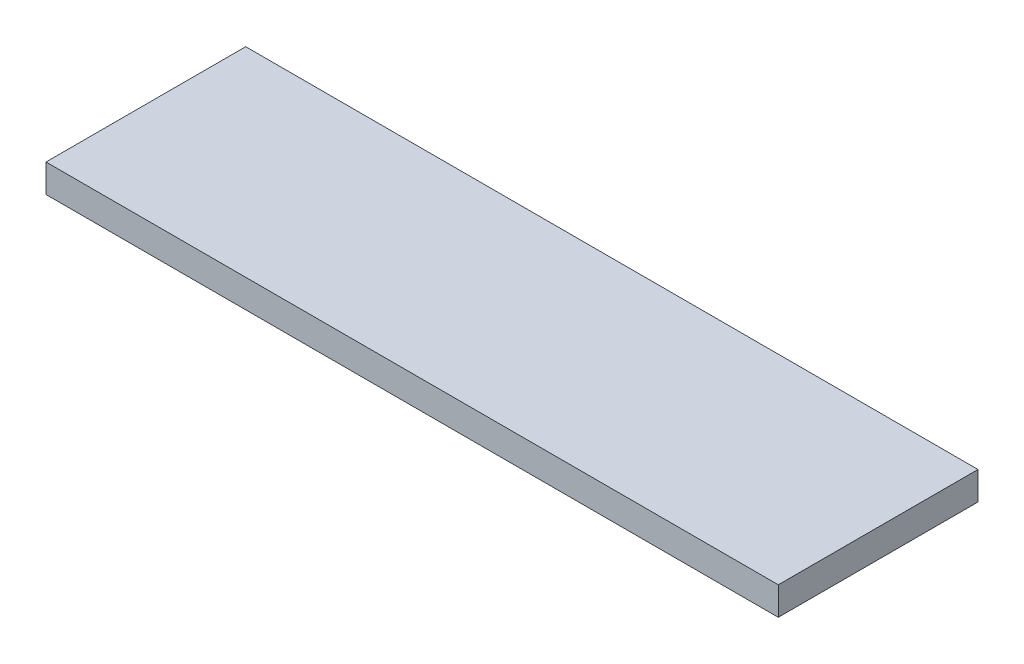
ISO-10303-21;
HEADER;
FILE_DESCRIPTION(('STEP AP214'),'2;1');
FILE_NAME('part.step','',(''),(''),'','','');
FILE_SCHEMA(('AUTOMOTIVE_DESIGN { 1 0 10303 214 1 1 1 1 }'));
ENDSEC;
DATA;
#1=APPLICATION_CONTEXT('core data for automotive mechanical design processes');
#2=APPLICATION_PROTOCOL_DEFINITION('international standard','automotive_design',2000,#1);
#3=PRODUCT_CONTEXT('',#1,'mechanical');
#4=PRODUCT('Part','Part','',(#3));
#5=PRODUCT_RELATED_PRODUCT_CATEGORY('part','',(#4));
#6=PRODUCT_DEFINITION_FORMATION('','',#4);
#7=PRODUCT_DEFINITION_CONTEXT('part definition',#1,'design');
#8=PRODUCT_DEFINITION('design','',#6,#7);
#9=PRODUCT_DEFINITION_SHAPE('','',#8);
#10=(LENGTH_UNIT() NAMED_UNIT(*) SI_UNIT(.MILLI.,.METRE.));
#11=(NAMED_UNIT(*) PLANE_ANGLE_UNIT() SI_UNIT($,.RADIAN.));
#12=(NAMED_UNIT(*) SI_UNIT($,.STERADIAN.) SOLID_ANGLE_UNIT());
#13=UNCERTAINTY_MEASURE_WITH_UNIT(LENGTH_MEASURE(1.E-05),#10,'distance_accuracy_value','');
#14=(GEOMETRIC_REPRESENTATION_CONTEXT(3) GLOBAL_UNCERTAINTY_ASSIGNED_CONTEXT((#13)) GLOBAL_UNIT_ASSIGNED_CONTEXT((#10,
#11,#12)) REPRESENTATION_CONTEXT('',''));
#15=CARTESIAN_POINT('',(0.,0.,0.));
#16=DIRECTION('',(0.,0.,1.));
#17=DIRECTION('',(1.,0.,0.));
#18=AXIS2_PLACEMENT_3D('',#15,#16,#17);
#19=CARTESIAN_POINT('',(82.5,6.35,22.5));
#20=DIRECTION('',(-1.,0.,0.));
#21=DIRECTION('',(0.,0.,1.));
#22=AXIS2_PLACEMENT_3D('',#19,#20,#21);
#23=PLANE('',#22);
#24=DIRECTION('',(0.,0.,-1.));
#25=VECTOR('',#24,1.);
#26=CARTESIAN_POINT('',(82.5,0.,22.5));
#27=LINE('',#26,#25);
#28=CARTESIAN_POINT('',(82.5,0.,22.5));
#29=VERTEX_POINT('',#28);
#30=CARTESIAN_POINT('',(82.5,0.,-22.5));
#31=VERTEX_POINT('',#30);
#32=EDGE_CURVE('E96',#29,#31,#27,.T.);
#33=ORIENTED_EDGE('',*,*,#32,.T.);
#34=DIRECTION('',(0.,-1.,0.));
#35=VECTOR('',#34,1.);
#36=CARTESIAN_POINT('',(82.5,6.35,-22.5));
#37=LINE('',#36,#35);
#38=CARTESIAN_POINT('',(82.5,6.35,-22.5));
#39=VERTEX_POINT('',#38);
#40=EDGE_CURVE('E11',#39,#31,#37,.T.);
#41=ORIENTED_EDGE('',*,*,#40,.F.);
#42=DIRECTION('',(0.,0.,-1.));
#43=VECTOR('',#42,1.);
#44=CARTESIAN_POINT('',(82.5,6.35,22.5));
#45=LINE('',#44,#43);
#46=CARTESIAN_POINT('',(82.5,6.35,22.5));
#47=VERTEX_POINT('',#46);
#48=EDGE_CURVE('E84',#47,#39,#45,.T.);
#49=ORIENTED_EDGE('',*,*,#48,.F.);
#50=DIRECTION('',(0.,-1.,0.));
#51=VECTOR('',#50,1.);
#52=CARTESIAN_POINT('',(82.5,6.35,22.5));
#53=LINE('',#52,#51);
#54=EDGE_CURVE('E92',#47,#29,#53,.T.);
#55=ORIENTED_EDGE('',*,*,#54,.T.);
#56=EDGE_LOOP('',(#33,#41,#49,#55));
#57=FACE_BOUND('',#56,.T.);
#58=ADVANCED_FACE('F33',(#57),#23,.F.);
#59=CARTESIAN_POINT('',(-82.5,6.35,-22.5));
#60=DIRECTION('',(0.,0.,1.));
#61=DIRECTION('',(1.,0.,0.));
#62=AXIS2_PLACEMENT_3D('',#59,#60,#61);
#63=PLANE('',#62);
#64=DIRECTION('',(-1.,0.,0.));
#65=VECTOR('',#64,1.);
#66=CARTESIAN_POINT('',(-82.5,0.,-22.5));
#67=LINE('',#66,#65);
#68=CARTESIAN_POINT('',(-82.5,0.,-22.5));
#69=VERTEX_POINT('',#68);
#70=EDGE_CURVE('E88',#31,#69,#67,.T.);
#71=ORIENTED_EDGE('',*,*,#70,.T.);
#72=DIRECTION('',(0.,-1.,0.));
#73=VECTOR('',#72,1.);
#74=CARTESIAN_POINT('',(-82.5,6.35,-22.5));
#75=LINE('',#74,#73);
#76=CARTESIAN_POINT('',(-82.5,6.35,-22.5));
#77=VERTEX_POINT('',#76);
#78=EDGE_CURVE('E41',#77,#69,#75,.T.);
#79=ORIENTED_EDGE('',*,*,#78,.F.);
#80=DIRECTION('',(-1.,0.,0.));
#81=VECTOR('',#80,1.);
#82=CARTESIAN_POINT('',(-82.5,6.35,-22.5));
#83=LINE('',#82,#81);
#84=EDGE_CURVE('E79',#39,#77,#83,.T.);
#85=ORIENTED_EDGE('',*,*,#84,.F.);
#86=ORIENTED_EDGE('',*,*,#40,.T.);
#87=EDGE_LOOP('',(#71,#79,#85,#86));
#88=FACE_BOUND('',#87,.T.);
#89=ADVANCED_FACE('F87',(#88),#63,.F.);
#90=CARTESIAN_POINT('',(-82.5,6.35,22.5));
#91=DIRECTION('',(1.,0.,0.));
#92=DIRECTION('',(0.,0.,-1.));
#93=AXIS2_PLACEMENT_3D('',#90,#91,#92);
#94=PLANE('',#93);
#95=DIRECTION('',(0.,0.,1.));
#96=VECTOR('',#95,1.);
#97=CARTESIAN_POINT('',(-82.5,0.,22.5));
#98=LINE('',#97,#96);
#99=CARTESIAN_POINT('',(-82.5,0.,22.5));
#100=VERTEX_POINT('',#99);
#101=EDGE_CURVE('E66',#69,#100,#98,.T.);
#102=ORIENTED_EDGE('',*,*,#101,.T.);
#103=DIRECTION('',(0.,-1.,0.));
#104=VECTOR('',#103,1.);
#105=CARTESIAN_POINT('',(-82.5,6.35,22.5));
#106=LINE('',#105,#104);
#107=CARTESIAN_POINT('',(-82.5,6.35,22.5));
#108=VERTEX_POINT('',#107);
#109=EDGE_CURVE('E89',#108,#100,#106,.T.);
#110=ORIENTED_EDGE('',*,*,#109,.F.);
#111=DIRECTION('',(0.,0.,1.));
#112=VECTOR('',#111,1.);
#113=CARTESIAN_POINT('',(-82.5,6.35,22.5));
#114=LINE('',#113,#112);
#115=EDGE_CURVE('E82',#77,#108,#114,.T.);
#116=ORIENTED_EDGE('',*,*,#115,.F.);
#117=ORIENTED_EDGE('',*,*,#78,.T.);
#118=EDGE_LOOP('',(#102,#110,#116,#117));
#119=FACE_BOUND('',#118,.T.);
#120=ADVANCED_FACE('F90',(#119),#94,.F.);
#121=CARTESIAN_POINT('',(-82.5,6.35,22.5));
#122=DIRECTION('',(0.,0.,-1.));
#123=DIRECTION('',(-1.,0.,0.));
#124=AXIS2_PLACEMENT_3D('',#121,#122,#123);
#125=PLANE('',#124);
#126=DIRECTION('',(1.,0.,0.));
#127=VECTOR('',#126,1.);
#128=CARTESIAN_POINT('',(-82.5,0.,22.5));
#129=LINE('',#128,#127);
#130=EDGE_CURVE('E72',#100,#29,#129,.T.);
#131=ORIENTED_EDGE('',*,*,#130,.T.);
#132=ORIENTED_EDGE('',*,*,#54,.F.);
#133=DIRECTION('',(1.,0.,0.));
#134=VECTOR('',#133,1.);
#135=CARTESIAN_POINT('',(-82.5,6.35,22.5));
#136=LINE('',#135,#134);
#137=EDGE_CURVE('E49',#108,#47,#136,.T.);
#138=ORIENTED_EDGE('',*,*,#137,.F.);
#139=ORIENTED_EDGE('',*,*,#109,.T.);
#140=EDGE_LOOP('',(#131,#132,#138,#139));
#141=FACE_BOUND('',#140,.T.);
#142=ADVANCED_FACE('F103',(#141),#125,.F.);
#143=CARTESIAN_POINT('',(0.,6.35,0.));
#144=DIRECTION('',(0.,-1.,0.));
#145=DIRECTION('',(0.,0.,-1.));
#146=AXIS2_PLACEMENT_3D('',#143,#144,#145);
#147=PLANE('',#146);
#148=ORIENTED_EDGE('',*,*,#48,.T.);
#149=ORIENTED_EDGE('',*,*,#84,.T.);
#150=ORIENTED_EDGE('',*,*,#115,.T.);
#151=ORIENTED_EDGE('',*,*,#137,.T.);
#152=EDGE_LOOP('',(#148,#149,#150,#151));
#153=FACE_BOUND('',#152,.T.);
#154=ADVANCED_FACE('F80',(#153),#147,.F.);
#155=CARTESIAN_POINT('',(0.,0.,0.));
#156=DIRECTION('',(0.,-1.,0.));
#157=DIRECTION('',(0.,0.,-1.));
#158=AXIS2_PLACEMENT_3D('',#155,#156,#157);
#159=PLANE('',#158);
#160=ORIENTED_EDGE('',*,*,#32,.F.);
#161=ORIENTED_EDGE('',*,*,#130,.F.);
#162=ORIENTED_EDGE('',*,*,#101,.F.);
#163=ORIENTED_EDGE('',*,*,#70,.F.);
#164=EDGE_LOOP('',(#160,#161,#162,#163));
#165=FACE_BOUND('',#164,.T.);
#166=ADVANCED_FACE('F106',(#165),#159,.T.);
#167=CLOSED_SHELL('',(#58,#89,#120,#142,#154,#166));
#168=MANIFOLD_SOLID_BREP('B2',#167);
#169=ADVANCED_BREP_SHAPE_REPRESENTATION('',(#18,#168),#14);
#170=SHAPE_DEFINITION_REPRESENTATION(#9,#169);
ENDSEC;
END-ISO-10303-21;
